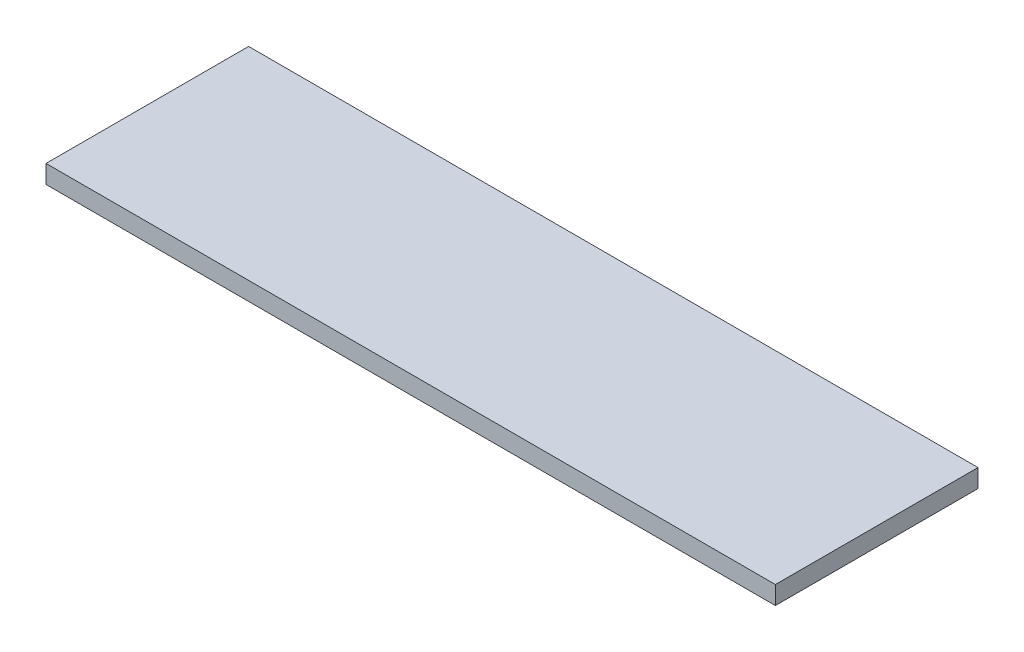
ISO-10303-21;
HEADER;
FILE_DESCRIPTION(('STEP AP214'),'2;1');
FILE_NAME('part.step','',(''),(''),'','','');
FILE_SCHEMA(('AUTOMOTIVE_DESIGN { 1 0 10303 214 1 1 1 1 }'));
ENDSEC;
DATA;
#1=APPLICATION_CONTEXT('core data for automotive mechanical design processes');
#2=APPLICATION_PROTOCOL_DEFINITION('international standard','automotive_design',2000,#1);
#3=PRODUCT_CONTEXT('',#1,'mechanical');
#4=PRODUCT('Part','Part','',(#3));
#5=PRODUCT_RELATED_PRODUCT_CATEGORY('part','',(#4));
#6=PRODUCT_DEFINITION_FORMATION('','',#4);
#7=PRODUCT_DEFINITION_CONTEXT('part definition',#1,'design');
#8=PRODUCT_DEFINITION('design','',#6,#7);
#9=PRODUCT_DEFINITION_SHAPE('','',#8);
#10=(LENGTH_UNIT() NAMED_UNIT(*) SI_UNIT(.MILLI.,.METRE.));
#11=(NAMED_UNIT(*) PLANE_ANGLE_UNIT() SI_UNIT($,.RADIAN.));
#12=(NAMED_UNIT(*) SI_UNIT($,.STERADIAN.) SOLID_ANGLE_UNIT());
#13=UNCERTAINTY_MEASURE_WITH_UNIT(LENGTH_MEASURE(1.E-05),#10,'distance_accuracy_value','');
#14=(GEOMETRIC_REPRESENTATION_CONTEXT(3) GLOBAL_UNCERTAINTY_ASSIGNED_CONTEXT((#13)) GLOBAL_UNIT_ASSIGNED_CONTEXT((#10,
#11,#12)) REPRESENTATION_CONTEXT('',''));
#15=CARTESIAN_POINT('',(0.,0.,0.));
#16=DIRECTION('',(0.,0.,1.));
#17=DIRECTION('',(1.,0.,0.));
#18=AXIS2_PLACEMENT_3D('',#15,#16,#17);
#19=CARTESIAN_POINT('',(360.,18.,-100.));
#20=DIRECTION('',(-1.,0.,0.));
#21=DIRECTION('',(0.,0.,1.));
#22=AXIS2_PLACEMENT_3D('',#19,#20,#21);
#23=PLANE('',#22);
#24=DIRECTION('',(0.,0.,-1.));
#25=VECTOR('',#24,1.);
#26=CARTESIAN_POINT('',(360.,0.,-100.));
#27=LINE('',#26,#25);
#28=CARTESIAN_POINT('',(360.,0.,100.));
#29=VERTEX_POINT('',#28);
#30=CARTESIAN_POINT('',(360.,0.,-100.));
#31=VERTEX_POINT('',#30);
#32=EDGE_CURVE('E96',#29,#31,#27,.T.);
#33=ORIENTED_EDGE('',*,*,#32,.T.);
#34=DIRECTION('',(0.,-1.,0.));
#35=VECTOR('',#34,1.);
#36=CARTESIAN_POINT('',(360.,18.,-100.));
#37=LINE('',#36,#35);
#38=CARTESIAN_POINT('',(360.,18.,-100.));
#39=VERTEX_POINT('',#38);
#40=EDGE_CURVE('E11',#39,#31,#37,.T.);
#41=ORIENTED_EDGE('',*,*,#40,.F.);
#42=DIRECTION('',(0.,0.,-1.));
#43=VECTOR('',#42,1.);
#44=CARTESIAN_POINT('',(360.,18.,-100.));
#45=LINE('',#44,#43);
#46=CARTESIAN_POINT('',(360.,18.,100.));
#47=VERTEX_POINT('',#46);
#48=EDGE_CURVE('E84',#47,#39,#45,.T.);
#49=ORIENTED_EDGE('',*,*,#48,.F.);
#50=DIRECTION('',(0.,-1.,0.));
#51=VECTOR('',#50,1.);
#52=CARTESIAN_POINT('',(360.,18.,100.));
#53=LINE('',#52,#51);
#54=EDGE_CURVE('E92',#47,#29,#53,.T.);
#55=ORIENTED_EDGE('',*,*,#54,.T.);
#56=EDGE_LOOP('',(#33,#41,#49,#55));
#57=FACE_BOUND('',#56,.T.);
#58=ADVANCED_FACE('F33',(#57),#23,.F.);
#59=CARTESIAN_POINT('',(-360.,18.,-100.));
#60=DIRECTION('',(0.,0.,1.));
#61=DIRECTION('',(1.,0.,0.));
#62=AXIS2_PLACEMENT_3D('',#59,#60,#61);
#63=PLANE('',#62);
#64=DIRECTION('',(-1.,0.,0.));
#65=VECTOR('',#64,1.);
#66=CARTESIAN_POINT('',(-360.,0.,-100.));
#67=LINE('',#66,#65);
#68=CARTESIAN_POINT('',(-360.,0.,-100.));
#69=VERTEX_POINT('',#68);
#70=EDGE_CURVE('E88',#31,#69,#67,.T.);
#71=ORIENTED_EDGE('',*,*,#70,.T.);
#72=DIRECTION('',(0.,-1.,0.));
#73=VECTOR('',#72,1.);
#74=CARTESIAN_POINT('',(-360.,18.,-100.));
#75=LINE('',#74,#73);
#76=CARTESIAN_POINT('',(-360.,18.,-100.));
#77=VERTEX_POINT('',#76);
#78=EDGE_CURVE('E41',#77,#69,#75,.T.);
#79=ORIENTED_EDGE('',*,*,#78,.F.);
#80=DIRECTION('',(-1.,0.,0.));
#81=VECTOR('',#80,1.);
#82=CARTESIAN_POINT('',(-360.,18.,-100.));
#83=LINE('',#82,#81);
#84=EDGE_CURVE('E79',#39,#77,#83,.T.);
#85=ORIENTED_EDGE('',*,*,#84,.F.);
#86=ORIENTED_EDGE('',*,*,#40,.T.);
#87=EDGE_LOOP('',(#71,#79,#85,#86));
#88=FACE_BOUND('',#87,.T.);
#89=ADVANCED_FACE('F87',(#88),#63,.F.);
#90=CARTESIAN_POINT('',(-360.,18.,-100.));
#91=DIRECTION('',(1.,0.,0.));
#92=DIRECTION('',(0.,0.,-1.));
#93=AXIS2_PLACEMENT_3D('',#90,#91,#92);
#94=PLANE('',#93);
#95=DIRECTION('',(0.,0.,1.));
#96=VECTOR('',#95,1.);
#97=CARTESIAN_POINT('',(-360.,0.,-100.));
#98=LINE('',#97,#96);
#99=CARTESIAN_POINT('',(-360.,0.,100.));
#100=VERTEX_POINT('',#99);
#101=EDGE_CURVE('E66',#69,#100,#98,.T.);
#102=ORIENTED_EDGE('',*,*,#101,.T.);
#103=DIRECTION('',(0.,-1.,0.));
#104=VECTOR('',#103,1.);
#105=CARTESIAN_POINT('',(-360.,18.,100.));
#106=LINE('',#105,#104);
#107=CARTESIAN_POINT('',(-360.,18.,100.));
#108=VERTEX_POINT('',#107);
#109=EDGE_CURVE('E89',#108,#100,#106,.T.);
#110=ORIENTED_EDGE('',*,*,#109,.F.);
#111=DIRECTION('',(0.,0.,1.));
#112=VECTOR('',#111,1.);
#113=CARTESIAN_POINT('',(-360.,18.,-100.));
#114=LINE('',#113,#112);
#115=EDGE_CURVE('E82',#77,#108,#114,.T.);
#116=ORIENTED_EDGE('',*,*,#115,.F.);
#117=ORIENTED_EDGE('',*,*,#78,.T.);
#118=EDGE_LOOP('',(#102,#110,#116,#117));
#119=FACE_BOUND('',#118,.T.);
#120=ADVANCED_FACE('F90',(#119),#94,.F.);
#121=CARTESIAN_POINT('',(-360.,18.,100.));
#122=DIRECTION('',(0.,0.,-1.));
#123=DIRECTION('',(-1.,0.,0.));
#124=AXIS2_PLACEMENT_3D('',#121,#122,#123);
#125=PLANE('',#124);
#126=DIRECTION('',(1.,0.,0.));
#127=VECTOR('',#126,1.);
#128=CARTESIAN_POINT('',(-360.,0.,100.));
#129=LINE('',#128,#127);
#130=EDGE_CURVE('E72',#100,#29,#129,.T.);
#131=ORIENTED_EDGE('',*,*,#130,.T.);
#132=ORIENTED_EDGE('',*,*,#54,.F.);
#133=DIRECTION('',(1.,0.,0.));
#134=VECTOR('',#133,1.);
#135=CARTESIAN_POINT('',(-360.,18.,100.));
#136=LINE('',#135,#134);
#137=EDGE_CURVE('E49',#108,#47,#136,.T.);
#138=ORIENTED_EDGE('',*,*,#137,.F.);
#139=ORIENTED_EDGE('',*,*,#109,.T.);
#140=EDGE_LOOP('',(#131,#132,#138,#139));
#141=FACE_BOUND('',#140,.T.);
#142=ADVANCED_FACE('F103',(#141),#125,.F.);
#143=CARTESIAN_POINT('',(0.,18.,0.));
#144=DIRECTION('',(0.,1.,0.));
#145=DIRECTION('',(0.,0.,1.));
#146=AXIS2_PLACEMENT_3D('',#143,#144,#145);
#147=PLANE('',#146);
#148=ORIENTED_EDGE('',*,*,#48,.T.);
#149=ORIENTED_EDGE('',*,*,#84,.T.);
#150=ORIENTED_EDGE('',*,*,#115,.T.);
#151=ORIENTED_EDGE('',*,*,#137,.T.);
#152=EDGE_LOOP('',(#148,#149,#150,#151));
#153=FACE_BOUND('',#152,.T.);
#154=ADVANCED_FACE('F80',(#153),#147,.T.);
#155=CARTESIAN_POINT('',(0.,0.,0.));
#156=DIRECTION('',(0.,1.,0.));
#157=DIRECTION('',(0.,0.,1.));
#158=AXIS2_PLACEMENT_3D('',#155,#156,#157);
#159=PLANE('',#158);
#160=ORIENTED_EDGE('',*,*,#32,.F.);
#161=ORIENTED_EDGE('',*,*,#130,.F.);
#162=ORIENTED_EDGE('',*,*,#101,.F.);
#163=ORIENTED_EDGE('',*,*,#70,.F.);
#164=EDGE_LOOP('',(#160,#161,#162,#163));
#165=FACE_BOUND('',#164,.T.);
#166=ADVANCED_FACE('F106',(#165),#159,.F.);
#167=CLOSED_SHELL('',(#58,#89,#120,#142,#154,#166));
#168=MANIFOLD_SOLID_BREP('B2',#167);
#169=ADVANCED_BREP_SHAPE_REPRESENTATION('',(#18,#168),#14);
#170=SHAPE_DEFINITION_REPRESENTATION(#9,#169);
ENDSEC;
END-ISO-10303-21;
